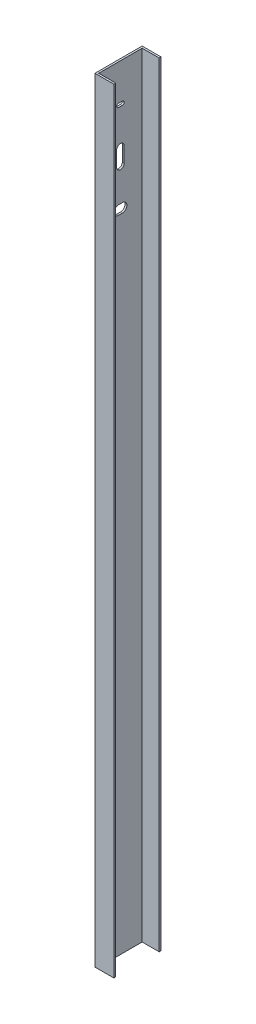
ISO-10303-21;
HEADER;
FILE_DESCRIPTION(('STEP AP214'),'2;1');
FILE_NAME('part.step','',(''),(''),'','','');
FILE_SCHEMA(('AUTOMOTIVE_DESIGN { 1 0 10303 214 1 1 1 1 }'));
ENDSEC;
DATA;
#1=APPLICATION_CONTEXT('core data for automotive mechanical design processes');
#2=APPLICATION_PROTOCOL_DEFINITION('international standard','automotive_design',2000,#1);
#3=PRODUCT_CONTEXT('',#1,'mechanical');
#4=PRODUCT('Part','Part','',(#3));
#5=PRODUCT_RELATED_PRODUCT_CATEGORY('part','',(#4));
#6=PRODUCT_DEFINITION_FORMATION('','',#4);
#7=PRODUCT_DEFINITION_CONTEXT('part definition',#1,'design');
#8=PRODUCT_DEFINITION('design','',#6,#7);
#9=PRODUCT_DEFINITION_SHAPE('','',#8);
#10=(LENGTH_UNIT() NAMED_UNIT(*) SI_UNIT(.MILLI.,.METRE.));
#11=(NAMED_UNIT(*) PLANE_ANGLE_UNIT() SI_UNIT($,.RADIAN.));
#12=(NAMED_UNIT(*) SI_UNIT($,.STERADIAN.) SOLID_ANGLE_UNIT());
#13=UNCERTAINTY_MEASURE_WITH_UNIT(LENGTH_MEASURE(1.E-05),#10,'distance_accuracy_value','');
#14=(GEOMETRIC_REPRESENTATION_CONTEXT(3) GLOBAL_UNCERTAINTY_ASSIGNED_CONTEXT((#13)) GLOBAL_UNIT_ASSIGNED_CONTEXT((#10,
#11,#12)) REPRESENTATION_CONTEXT('',''));
#15=CARTESIAN_POINT('',(0.,0.,0.));
#16=DIRECTION('',(0.,0.,1.));
#17=DIRECTION('',(1.,0.,0.));
#18=AXIS2_PLACEMENT_3D('',#15,#16,#17);
#19=CARTESIAN_POINT('',(0.,410.,0.));
#20=DIRECTION('',(1.,0.,0.));
#21=DIRECTION('',(0.,0.,-1.));
#22=AXIS2_PLACEMENT_3D('',#19,#20,#21);
#23=PLANE('',#22);
#24=DIRECTION('',(0.,0.,1.));
#25=VECTOR('',#24,1.);
#26=CARTESIAN_POINT('',(0.,339.6,11.5));
#27=LINE('',#26,#25);
#28=CARTESIAN_POINT('',(0.,339.6,11.5));
#29=VERTEX_POINT('',#28);
#30=CARTESIAN_POINT('',(0.,339.6,13.5));
#31=VERTEX_POINT('',#30);
#32=EDGE_CURVE('E183',#29,#31,#27,.T.);
#33=ORIENTED_EDGE('',*,*,#32,.F.);
#34=CARTESIAN_POINT('',(0.,342.,11.5));
#35=DIRECTION('',(-1.,0.,0.));
#36=DIRECTION('',(0.,0.,1.));
#37=AXIS2_PLACEMENT_3D('',#34,#35,#36);
#38=CIRCLE('',#37,2.40000000000001);
#39=CARTESIAN_POINT('',(0.,344.4,11.5));
#40=VERTEX_POINT('',#39);
#41=EDGE_CURVE('E49',#40,#29,#38,.T.);
#42=ORIENTED_EDGE('',*,*,#41,.F.);
#43=DIRECTION('',(0.,0.,1.));
#44=VECTOR('',#43,1.);
#45=CARTESIAN_POINT('',(0.,344.4,11.5));
#46=LINE('',#45,#44);
#47=CARTESIAN_POINT('',(0.,344.4,13.5));
#48=VERTEX_POINT('',#47);
#49=EDGE_CURVE('E189',#40,#48,#46,.T.);
#50=ORIENTED_EDGE('',*,*,#49,.T.);
#51=CARTESIAN_POINT('',(0.,342.,13.5));
#52=DIRECTION('',(-1.,0.,0.));
#53=DIRECTION('',(0.,0.,1.));
#54=AXIS2_PLACEMENT_3D('',#51,#52,#53);
#55=CIRCLE('',#54,2.40000000000001);
#56=EDGE_CURVE('E174',#31,#48,#55,.T.);
#57=ORIENTED_EDGE('',*,*,#56,.F.);
#58=EDGE_LOOP('',(#33,#42,#50,#57));
#59=FACE_BOUND('',#58,.T.);
#60=DIRECTION('',(0.,0.,1.));
#61=VECTOR('',#60,1.);
#62=CARTESIAN_POINT('',(0.,0.,0.));
#63=LINE('',#62,#61);
#64=CARTESIAN_POINT('',(0.,0.,0.));
#65=VERTEX_POINT('',#64);
#66=CARTESIAN_POINT('',(0.,0.,25.));
#67=VERTEX_POINT('',#66);
#68=EDGE_CURVE('E265',#65,#67,#63,.T.);
#69=ORIENTED_EDGE('',*,*,#68,.T.);
#70=DIRECTION('',(0.,-1.,0.));
#71=VECTOR('',#70,1.);
#72=CARTESIAN_POINT('',(0.,410.,25.));
#73=LINE('',#72,#71);
#74=CARTESIAN_POINT('',(0.,410.,25.));
#75=VERTEX_POINT('',#74);
#76=EDGE_CURVE('E296',#75,#67,#73,.T.);
#77=ORIENTED_EDGE('',*,*,#76,.F.);
#78=DIRECTION('',(0.,0.,1.));
#79=VECTOR('',#78,1.);
#80=CARTESIAN_POINT('',(0.,410.,0.));
#81=LINE('',#80,#79);
#82=CARTESIAN_POINT('',(0.,410.,0.));
#83=VERTEX_POINT('',#82);
#84=EDGE_CURVE('E266',#83,#75,#81,.T.);
#85=ORIENTED_EDGE('',*,*,#84,.F.);
#86=DIRECTION('',(0.,-1.,0.));
#87=VECTOR('',#86,1.);
#88=CARTESIAN_POINT('',(0.,410.,0.));
#89=LINE('',#88,#87);
#90=EDGE_CURVE('E278',#83,#65,#89,.T.);
#91=ORIENTED_EDGE('',*,*,#90,.T.);
#92=EDGE_LOOP('',(#69,#77,#85,#91));
#93=FACE_BOUND('',#92,.T.);
#94=DIRECTION('',(0.,0.,1.));
#95=VECTOR('',#94,1.);
#96=CARTESIAN_POINT('',(0.,389.,11.5));
#97=LINE('',#96,#95);
#98=CARTESIAN_POINT('',(0.,389.,11.5));
#99=VERTEX_POINT('',#98);
#100=CARTESIAN_POINT('',(0.,389.,13.5));
#101=VERTEX_POINT('',#100);
#102=EDGE_CURVE('E221',#99,#101,#97,.T.);
#103=ORIENTED_EDGE('',*,*,#102,.F.);
#104=CARTESIAN_POINT('',(0.,390.,11.5));
#105=DIRECTION('',(-1.,0.,0.));
#106=DIRECTION('',(0.,0.,1.));
#107=AXIS2_PLACEMENT_3D('',#104,#105,#106);
#108=CIRCLE('',#107,1.);
#109=CARTESIAN_POINT('',(0.,391.,11.5));
#110=VERTEX_POINT('',#109);
#111=EDGE_CURVE('E219',#110,#99,#108,.T.);
#112=ORIENTED_EDGE('',*,*,#111,.F.);
#113=DIRECTION('',(0.,0.,1.));
#114=VECTOR('',#113,1.);
#115=CARTESIAN_POINT('',(0.,391.,11.5));
#116=LINE('',#115,#114);
#117=CARTESIAN_POINT('',(0.,391.,13.5));
#118=VERTEX_POINT('',#117);
#119=EDGE_CURVE('E227',#110,#118,#116,.T.);
#120=ORIENTED_EDGE('',*,*,#119,.T.);
#121=CARTESIAN_POINT('',(0.,390.,13.5));
#122=DIRECTION('',(-1.,0.,0.));
#123=DIRECTION('',(0.,0.,1.));
#124=AXIS2_PLACEMENT_3D('',#121,#122,#123);
#125=CIRCLE('',#124,1.);
#126=EDGE_CURVE('E224',#101,#118,#125,.T.);
#127=ORIENTED_EDGE('',*,*,#126,.F.);
#128=EDGE_LOOP('',(#103,#112,#120,#127));
#129=FACE_BOUND('',#128,.T.);
#130=DIRECTION('',(0.,-1.,0.));
#131=VECTOR('',#130,1.);
#132=CARTESIAN_POINT('',(0.,370.,14.5));
#133=LINE('',#132,#131);
#134=CARTESIAN_POINT('',(0.,370.,14.5));
#135=VERTEX_POINT('',#134);
#136=CARTESIAN_POINT('',(0.,362.,14.5));
#137=VERTEX_POINT('',#136);
#138=EDGE_CURVE('E196',#135,#137,#133,.T.);
#139=ORIENTED_EDGE('',*,*,#138,.T.);
#140=CARTESIAN_POINT('',(0.,362.,12.5));
#141=DIRECTION('',(-1.,0.,0.));
#142=DIRECTION('',(0.,0.,1.));
#143=AXIS2_PLACEMENT_3D('',#140,#141,#142);
#144=CIRCLE('',#143,2.);
#145=CARTESIAN_POINT('',(0.,362.,10.5));
#146=VERTEX_POINT('',#145);
#147=EDGE_CURVE('E201',#146,#137,#144,.T.);
#148=ORIENTED_EDGE('',*,*,#147,.F.);
#149=DIRECTION('',(0.,-1.,0.));
#150=VECTOR('',#149,1.);
#151=CARTESIAN_POINT('',(0.,370.,10.5));
#152=LINE('',#151,#150);
#153=CARTESIAN_POINT('',(0.,370.,10.5));
#154=VERTEX_POINT('',#153);
#155=EDGE_CURVE('E204',#154,#146,#152,.T.);
#156=ORIENTED_EDGE('',*,*,#155,.F.);
#157=CARTESIAN_POINT('',(0.,370.,12.5));
#158=DIRECTION('',(-1.,0.,0.));
#159=DIRECTION('',(0.,0.,1.));
#160=AXIS2_PLACEMENT_3D('',#157,#158,#159);
#161=CIRCLE('',#160,2.);
#162=EDGE_CURVE('E207',#135,#154,#161,.T.);
#163=ORIENTED_EDGE('',*,*,#162,.F.);
#164=EDGE_LOOP('',(#139,#148,#156,#163));
#165=FACE_BOUND('',#164,.T.);
#166=ADVANCED_FACE('F35',(#59,#93,#129,#165),#23,.F.);
#167=CARTESIAN_POINT('',(1.,0.,1.));
#168=DIRECTION('',(-1.,0.,0.));
#169=DIRECTION('',(0.,0.,1.));
#170=AXIS2_PLACEMENT_3D('',#167,#168,#169);
#171=PLANE('',#170);
#172=DIRECTION('',(0.,0.,1.));
#173=VECTOR('',#172,1.);
#174=CARTESIAN_POINT('',(1.,344.4,1.));
#175=LINE('',#174,#173);
#176=CARTESIAN_POINT('',(1.00000000000011,344.4,11.5));
#177=VERTEX_POINT('',#176);
#178=CARTESIAN_POINT('',(1.00000000000011,344.4,13.5));
#179=VERTEX_POINT('',#178);
#180=EDGE_CURVE('E42',#177,#179,#175,.T.);
#181=ORIENTED_EDGE('',*,*,#180,.F.);
#182=CARTESIAN_POINT('',(1.,342.,11.5));
#183=DIRECTION('',(-1.,0.,0.));
#184=DIRECTION('',(0.,0.,1.));
#185=AXIS2_PLACEMENT_3D('',#182,#183,#184);
#186=CIRCLE('',#185,2.40000000000001);
#187=CARTESIAN_POINT('',(1.00000000000011,339.6,11.5));
#188=VERTEX_POINT('',#187);
#189=EDGE_CURVE('E11',#177,#188,#186,.T.);
#190=ORIENTED_EDGE('',*,*,#189,.T.);
#191=DIRECTION('',(0.,0.,1.));
#192=VECTOR('',#191,1.);
#193=CARTESIAN_POINT('',(1.,339.6,1.));
#194=LINE('',#193,#192);
#195=CARTESIAN_POINT('',(1.,339.6,13.5));
#196=VERTEX_POINT('',#195);
#197=EDGE_CURVE('E321',#188,#196,#194,.T.);
#198=ORIENTED_EDGE('',*,*,#197,.T.);
#199=CARTESIAN_POINT('',(1.,342.,13.5));
#200=DIRECTION('',(-1.,0.,0.));
#201=DIRECTION('',(0.,0.,1.));
#202=AXIS2_PLACEMENT_3D('',#199,#200,#201);
#203=CIRCLE('',#202,2.40000000000001);
#204=EDGE_CURVE('E177',#196,#179,#203,.T.);
#205=ORIENTED_EDGE('',*,*,#204,.T.);
#206=EDGE_LOOP('',(#181,#190,#198,#205));
#207=FACE_BOUND('',#206,.T.);
#208=DIRECTION('',(0.,0.,1.));
#209=VECTOR('',#208,1.);
#210=CARTESIAN_POINT('',(1.,410.,1.));
#211=LINE('',#210,#209);
#212=CARTESIAN_POINT('',(1.,410.,1.));
#213=VERTEX_POINT('',#212);
#214=CARTESIAN_POINT('',(1.,410.,24.));
#215=VERTEX_POINT('',#214);
#216=EDGE_CURVE('E252',#213,#215,#211,.T.);
#217=ORIENTED_EDGE('',*,*,#216,.T.);
#218=DIRECTION('',(0.,1.,0.));
#219=VECTOR('',#218,1.);
#220=CARTESIAN_POINT('',(1.,0.,24.));
#221=LINE('',#220,#219);
#222=CARTESIAN_POINT('',(1.,0.,24.));
#223=VERTEX_POINT('',#222);
#224=EDGE_CURVE('E260',#223,#215,#221,.T.);
#225=ORIENTED_EDGE('',*,*,#224,.F.);
#226=DIRECTION('',(0.,0.,1.));
#227=VECTOR('',#226,1.);
#228=CARTESIAN_POINT('',(1.,0.,1.));
#229=LINE('',#228,#227);
#230=CARTESIAN_POINT('',(1.,0.,1.));
#231=VERTEX_POINT('',#230);
#232=EDGE_CURVE('E242',#231,#223,#229,.T.);
#233=ORIENTED_EDGE('',*,*,#232,.F.);
#234=DIRECTION('',(0.,1.,0.));
#235=VECTOR('',#234,1.);
#236=CARTESIAN_POINT('',(1.,0.,1.));
#237=LINE('',#236,#235);
#238=EDGE_CURVE('E258',#231,#213,#237,.T.);
#239=ORIENTED_EDGE('',*,*,#238,.T.);
#240=EDGE_LOOP('',(#217,#225,#233,#239));
#241=FACE_BOUND('',#240,.T.);
#242=DIRECTION('',(0.,0.,1.));
#243=VECTOR('',#242,1.);
#244=CARTESIAN_POINT('',(1.,391.,1.));
#245=LINE('',#244,#243);
#246=CARTESIAN_POINT('',(1.00000000000011,391.,11.5));
#247=VERTEX_POINT('',#246);
#248=CARTESIAN_POINT('',(1.00000000000011,391.,13.5));
#249=VERTEX_POINT('',#248);
#250=EDGE_CURVE('E305',#247,#249,#245,.T.);
#251=ORIENTED_EDGE('',*,*,#250,.F.);
#252=CARTESIAN_POINT('',(1.,390.,11.5));
#253=DIRECTION('',(-1.,0.,0.));
#254=DIRECTION('',(0.,0.,1.));
#255=AXIS2_PLACEMENT_3D('',#252,#253,#254);
#256=CIRCLE('',#255,1.);
#257=CARTESIAN_POINT('',(1.00000000000011,389.,11.5));
#258=VERTEX_POINT('',#257);
#259=EDGE_CURVE('E307',#247,#258,#256,.T.);
#260=ORIENTED_EDGE('',*,*,#259,.T.);
#261=DIRECTION('',(0.,0.,1.));
#262=VECTOR('',#261,1.);
#263=CARTESIAN_POINT('',(1.,389.,1.));
#264=LINE('',#263,#262);
#265=CARTESIAN_POINT('',(1.,389.,13.5));
#266=VERTEX_POINT('',#265);
#267=EDGE_CURVE('E299',#258,#266,#264,.T.);
#268=ORIENTED_EDGE('',*,*,#267,.T.);
#269=CARTESIAN_POINT('',(1.,390.,13.5));
#270=DIRECTION('',(-1.,0.,0.));
#271=DIRECTION('',(0.,0.,1.));
#272=AXIS2_PLACEMENT_3D('',#269,#270,#271);
#273=CIRCLE('',#272,1.);
#274=EDGE_CURVE('E302',#266,#249,#273,.T.);
#275=ORIENTED_EDGE('',*,*,#274,.T.);
#276=EDGE_LOOP('',(#251,#260,#268,#275));
#277=FACE_BOUND('',#276,.T.);
#278=DIRECTION('',(0.,-1.,0.));
#279=VECTOR('',#278,1.);
#280=CARTESIAN_POINT('',(1.,0.,14.5000000000001));
#281=LINE('',#280,#279);
#282=CARTESIAN_POINT('',(1.00000000000011,370.,14.5));
#283=VERTEX_POINT('',#282);
#284=CARTESIAN_POINT('',(1.00000000000011,362.,14.5));
#285=VERTEX_POINT('',#284);
#286=EDGE_CURVE('E319',#283,#285,#281,.T.);
#287=ORIENTED_EDGE('',*,*,#286,.F.);
#288=CARTESIAN_POINT('',(1.,370.,12.5));
#289=DIRECTION('',(-1.,0.,0.));
#290=DIRECTION('',(0.,0.,1.));
#291=AXIS2_PLACEMENT_3D('',#288,#289,#290);
#292=CIRCLE('',#291,2.);
#293=CARTESIAN_POINT('',(1.,370.,10.5));
#294=VERTEX_POINT('',#293);
#295=EDGE_CURVE('E310',#283,#294,#292,.T.);
#296=ORIENTED_EDGE('',*,*,#295,.T.);
#297=DIRECTION('',(0.,-1.,0.));
#298=VECTOR('',#297,1.);
#299=CARTESIAN_POINT('',(1.,0.,10.5));
#300=LINE('',#299,#298);
#301=CARTESIAN_POINT('',(1.00000000000011,362.,10.5));
#302=VERTEX_POINT('',#301);
#303=EDGE_CURVE('E313',#294,#302,#300,.T.);
#304=ORIENTED_EDGE('',*,*,#303,.T.);
#305=CARTESIAN_POINT('',(1.,362.,12.5));
#306=DIRECTION('',(-1.,0.,0.));
#307=DIRECTION('',(0.,0.,1.));
#308=AXIS2_PLACEMENT_3D('',#305,#306,#307);
#309=CIRCLE('',#308,2.);
#310=EDGE_CURVE('E316',#302,#285,#309,.T.);
#311=ORIENTED_EDGE('',*,*,#310,.T.);
#312=EDGE_LOOP('',(#287,#296,#304,#311));
#313=FACE_BOUND('',#312,.T.);
#314=ADVANCED_FACE('F328',(#207,#241,#277,#313),#171,.F.);
#315=CARTESIAN_POINT('',(10.,410.,0.));
#316=DIRECTION('',(-1.,0.,0.));
#317=DIRECTION('',(0.,0.,1.));
#318=AXIS2_PLACEMENT_3D('',#315,#316,#317);
#319=PLANE('',#318);
#320=DIRECTION('',(0.,1.,0.));
#321=VECTOR('',#320,1.);
#322=CARTESIAN_POINT('',(10.,0.,24.));
#323=LINE('',#322,#321);
#324=CARTESIAN_POINT('',(10.,0.,24.));
#325=VERTEX_POINT('',#324);
#326=CARTESIAN_POINT('',(10.,410.,24.));
#327=VERTEX_POINT('',#326);
#328=EDGE_CURVE('E262',#325,#327,#323,.T.);
#329=ORIENTED_EDGE('',*,*,#328,.T.);
#330=DIRECTION('',(0.,0.,-1.));
#331=VECTOR('',#330,1.);
#332=CARTESIAN_POINT('',(10.,410.,0.));
#333=LINE('',#332,#331);
#334=CARTESIAN_POINT('',(10.,410.,25.));
#335=VERTEX_POINT('',#334);
#336=EDGE_CURVE('E273',#335,#327,#333,.T.);
#337=ORIENTED_EDGE('',*,*,#336,.F.);
#338=DIRECTION('',(0.,-1.,0.));
#339=VECTOR('',#338,1.);
#340=CARTESIAN_POINT('',(10.,410.,25.));
#341=LINE('',#340,#339);
#342=CARTESIAN_POINT('',(10.,0.,25.));
#343=VERTEX_POINT('',#342);
#344=EDGE_CURVE('E293',#335,#343,#341,.T.);
#345=ORIENTED_EDGE('',*,*,#344,.T.);
#346=DIRECTION('',(0.,0.,-1.));
#347=VECTOR('',#346,1.);
#348=CARTESIAN_POINT('',(10.,0.,0.));
#349=LINE('',#348,#347);
#350=EDGE_CURVE('E284',#343,#325,#349,.T.);
#351=ORIENTED_EDGE('',*,*,#350,.T.);
#352=EDGE_LOOP('',(#329,#337,#345,#351));
#353=FACE_BOUND('',#352,.T.);
#354=ADVANCED_FACE('F347',(#353),#319,.F.);
#355=CARTESIAN_POINT('',(0.,410.,0.));
#356=DIRECTION('',(0.,1.,0.));
#357=DIRECTION('',(0.,0.,1.));
#358=AXIS2_PLACEMENT_3D('',#355,#356,#357);
#359=PLANE('',#358);
#360=ORIENTED_EDGE('',*,*,#336,.T.);
#361=DIRECTION('',(-1.,0.,0.));
#362=VECTOR('',#361,1.);
#363=CARTESIAN_POINT('',(10.,410.,24.));
#364=LINE('',#363,#362);
#365=EDGE_CURVE('E233',#327,#215,#364,.T.);
#366=ORIENTED_EDGE('',*,*,#365,.T.);
#367=ORIENTED_EDGE('',*,*,#216,.F.);
#368=DIRECTION('',(-1.,0.,0.));
#369=VECTOR('',#368,1.);
#370=CARTESIAN_POINT('',(10.,410.,1.));
#371=LINE('',#370,#369);
#372=CARTESIAN_POINT('',(10.,410.,1.));
#373=VERTEX_POINT('',#372);
#374=EDGE_CURVE('E243',#373,#213,#371,.T.);
#375=ORIENTED_EDGE('',*,*,#374,.F.);
#376=CARTESIAN_POINT('',(10.,410.,0.));
#377=VERTEX_POINT('',#376);
#378=EDGE_CURVE('E272',#373,#377,#333,.T.);
#379=ORIENTED_EDGE('',*,*,#378,.T.);
#380=DIRECTION('',(-1.,0.,0.));
#381=VECTOR('',#380,1.);
#382=CARTESIAN_POINT('',(0.,410.,0.));
#383=LINE('',#382,#381);
#384=EDGE_CURVE('E276',#377,#83,#383,.T.);
#385=ORIENTED_EDGE('',*,*,#384,.T.);
#386=ORIENTED_EDGE('',*,*,#84,.T.);
#387=DIRECTION('',(1.,0.,0.));
#388=VECTOR('',#387,1.);
#389=CARTESIAN_POINT('',(0.,410.,25.));
#390=LINE('',#389,#388);
#391=EDGE_CURVE('E269',#75,#335,#390,.T.);
#392=ORIENTED_EDGE('',*,*,#391,.T.);
#393=EDGE_LOOP('',(#360,#366,#367,#375,#379,#385,#386,#392));
#394=FACE_BOUND('',#393,.T.);
#395=ADVANCED_FACE('F352',(#394),#359,.T.);
#396=CARTESIAN_POINT('',(0.,0.,0.));
#397=DIRECTION('',(0.,1.,0.));
#398=DIRECTION('',(0.,0.,1.));
#399=AXIS2_PLACEMENT_3D('',#396,#397,#398);
#400=PLANE('',#399);
#401=DIRECTION('',(-1.,0.,0.));
#402=VECTOR('',#401,1.);
#403=CARTESIAN_POINT('',(10.,0.,24.));
#404=LINE('',#403,#402);
#405=EDGE_CURVE('E240',#325,#223,#404,.T.);
#406=ORIENTED_EDGE('',*,*,#405,.F.);
#407=ORIENTED_EDGE('',*,*,#350,.F.);
#408=DIRECTION('',(1.,0.,0.));
#409=VECTOR('',#408,1.);
#410=CARTESIAN_POINT('',(0.,0.,25.));
#411=LINE('',#410,#409);
#412=EDGE_CURVE('E281',#67,#343,#411,.T.);
#413=ORIENTED_EDGE('',*,*,#412,.F.);
#414=ORIENTED_EDGE('',*,*,#68,.F.);
#415=DIRECTION('',(-1.,0.,0.));
#416=VECTOR('',#415,1.);
#417=CARTESIAN_POINT('',(0.,0.,0.));
#418=LINE('',#417,#416);
#419=CARTESIAN_POINT('',(10.,0.,0.));
#420=VERTEX_POINT('',#419);
#421=EDGE_CURVE('E270',#420,#65,#418,.T.);
#422=ORIENTED_EDGE('',*,*,#421,.F.);
#423=CARTESIAN_POINT('',(10.,0.,1.));
#424=VERTEX_POINT('',#423);
#425=EDGE_CURVE('E283',#424,#420,#349,.T.);
#426=ORIENTED_EDGE('',*,*,#425,.F.);
#427=DIRECTION('',(-1.,0.,0.));
#428=VECTOR('',#427,1.);
#429=CARTESIAN_POINT('',(10.,0.,1.));
#430=LINE('',#429,#428);
#431=EDGE_CURVE('E246',#424,#231,#430,.T.);
#432=ORIENTED_EDGE('',*,*,#431,.T.);
#433=ORIENTED_EDGE('',*,*,#232,.T.);
#434=EDGE_LOOP('',(#406,#407,#413,#414,#422,#426,#432,#433));
#435=FACE_BOUND('',#434,.T.);
#436=ADVANCED_FACE('F367',(#435),#400,.F.);
#437=CARTESIAN_POINT('',(0.,410.,25.));
#438=DIRECTION('',(0.,0.,-1.));
#439=DIRECTION('',(-1.,0.,0.));
#440=AXIS2_PLACEMENT_3D('',#437,#438,#439);
#441=PLANE('',#440);
#442=ORIENTED_EDGE('',*,*,#412,.T.);
#443=ORIENTED_EDGE('',*,*,#344,.F.);
#444=ORIENTED_EDGE('',*,*,#391,.F.);
#445=ORIENTED_EDGE('',*,*,#76,.T.);
#446=EDGE_LOOP('',(#442,#443,#444,#445));
#447=FACE_BOUND('',#446,.T.);
#448=ADVANCED_FACE('F371',(#447),#441,.F.);
#449=ORIENTED_EDGE('',*,*,#378,.F.);
#450=DIRECTION('',(0.,1.,0.));
#451=VECTOR('',#450,1.);
#452=CARTESIAN_POINT('',(10.,0.,1.));
#453=LINE('',#452,#451);
#454=EDGE_CURVE('E249',#424,#373,#453,.T.);
#455=ORIENTED_EDGE('',*,*,#454,.F.);
#456=ORIENTED_EDGE('',*,*,#425,.T.);
#457=DIRECTION('',(0.,-1.,0.));
#458=VECTOR('',#457,1.);
#459=CARTESIAN_POINT('',(10.,410.,0.));
#460=LINE('',#459,#458);
#461=EDGE_CURVE('E290',#377,#420,#460,.T.);
#462=ORIENTED_EDGE('',*,*,#461,.F.);
#463=EDGE_LOOP('',(#449,#455,#456,#462));
#464=FACE_BOUND('',#463,.T.);
#465=ADVANCED_FACE('F355',(#464),#319,.F.);
#466=CARTESIAN_POINT('',(0.,410.,0.));
#467=DIRECTION('',(0.,0.,1.));
#468=DIRECTION('',(1.,0.,0.));
#469=AXIS2_PLACEMENT_3D('',#466,#467,#468);
#470=PLANE('',#469);
#471=ORIENTED_EDGE('',*,*,#421,.T.);
#472=ORIENTED_EDGE('',*,*,#90,.F.);
#473=ORIENTED_EDGE('',*,*,#384,.F.);
#474=ORIENTED_EDGE('',*,*,#461,.T.);
#475=EDGE_LOOP('',(#471,#472,#473,#474));
#476=FACE_BOUND('',#475,.T.);
#477=ADVANCED_FACE('F363',(#476),#470,.F.);
#478=CARTESIAN_POINT('',(10.,0.,24.));
#479=DIRECTION('',(0.,0.,-1.));
#480=DIRECTION('',(-1.,0.,0.));
#481=AXIS2_PLACEMENT_3D('',#478,#479,#480);
#482=PLANE('',#481);
#483=ORIENTED_EDGE('',*,*,#365,.F.);
#484=ORIENTED_EDGE('',*,*,#328,.F.);
#485=ORIENTED_EDGE('',*,*,#405,.T.);
#486=ORIENTED_EDGE('',*,*,#224,.T.);
#487=EDGE_LOOP('',(#483,#484,#485,#486));
#488=FACE_BOUND('',#487,.T.);
#489=ADVANCED_FACE('F360',(#488),#482,.T.);
#490=CARTESIAN_POINT('',(10.,0.,1.));
#491=DIRECTION('',(0.,0.,-1.));
#492=DIRECTION('',(-1.,0.,0.));
#493=AXIS2_PLACEMENT_3D('',#490,#491,#492);
#494=PLANE('',#493);
#495=ORIENTED_EDGE('',*,*,#374,.T.);
#496=ORIENTED_EDGE('',*,*,#238,.F.);
#497=ORIENTED_EDGE('',*,*,#431,.F.);
#498=ORIENTED_EDGE('',*,*,#454,.T.);
#499=EDGE_LOOP('',(#495,#496,#497,#498));
#500=FACE_BOUND('',#499,.T.);
#501=ADVANCED_FACE('F358',(#500),#494,.F.);
#502=CARTESIAN_POINT('',(410.,390.,11.5));
#503=DIRECTION('',(-1.,0.,0.));
#504=DIRECTION('',(0.,0.,1.));
#505=AXIS2_PLACEMENT_3D('',#502,#503,#504);
#506=CYLINDRICAL_SURFACE('',#505,1.);
#507=DIRECTION('',(-1.,0.,0.));
#508=VECTOR('',#507,1.);
#509=CARTESIAN_POINT('',(410.,391.,11.5));
#510=LINE('',#509,#508);
#511=EDGE_CURVE('E231',#247,#110,#510,.T.);
#512=ORIENTED_EDGE('',*,*,#511,.T.);
#513=ORIENTED_EDGE('',*,*,#111,.T.);
#514=DIRECTION('',(-1.,0.,0.));
#515=VECTOR('',#514,1.);
#516=CARTESIAN_POINT('',(410.,389.,11.5));
#517=LINE('',#516,#515);
#518=EDGE_CURVE('E230',#258,#99,#517,.T.);
#519=ORIENTED_EDGE('',*,*,#518,.F.);
#520=ORIENTED_EDGE('',*,*,#259,.F.);
#521=EDGE_LOOP('',(#512,#513,#519,#520));
#522=FACE_BOUND('',#521,.T.);
#523=ADVANCED_FACE('F403',(#522),#506,.F.);
#524=CARTESIAN_POINT('',(410.,391.,11.5));
#525=DIRECTION('',(0.,-1.,0.));
#526=DIRECTION('',(0.,0.,-1.));
#527=AXIS2_PLACEMENT_3D('',#524,#525,#526);
#528=PLANE('',#527);
#529=ORIENTED_EDGE('',*,*,#250,.T.);
#530=DIRECTION('',(-1.,0.,0.));
#531=VECTOR('',#530,1.);
#532=CARTESIAN_POINT('',(410.,391.,13.5));
#533=LINE('',#532,#531);
#534=EDGE_CURVE('E234',#249,#118,#533,.T.);
#535=ORIENTED_EDGE('',*,*,#534,.T.);
#536=ORIENTED_EDGE('',*,*,#119,.F.);
#537=ORIENTED_EDGE('',*,*,#511,.F.);
#538=EDGE_LOOP('',(#529,#535,#536,#537));
#539=FACE_BOUND('',#538,.T.);
#540=ADVANCED_FACE('F407',(#539),#528,.T.);
#541=CARTESIAN_POINT('',(410.,390.,13.5));
#542=DIRECTION('',(-1.,0.,0.));
#543=DIRECTION('',(0.,0.,1.));
#544=AXIS2_PLACEMENT_3D('',#541,#542,#543);
#545=CYLINDRICAL_SURFACE('',#544,1.);
#546=DIRECTION('',(-1.,0.,0.));
#547=VECTOR('',#546,1.);
#548=CARTESIAN_POINT('',(410.,389.,13.5));
#549=LINE('',#548,#547);
#550=EDGE_CURVE('E236',#266,#101,#549,.T.);
#551=ORIENTED_EDGE('',*,*,#550,.T.);
#552=ORIENTED_EDGE('',*,*,#126,.T.);
#553=ORIENTED_EDGE('',*,*,#534,.F.);
#554=ORIENTED_EDGE('',*,*,#274,.F.);
#555=EDGE_LOOP('',(#551,#552,#553,#554));
#556=FACE_BOUND('',#555,.T.);
#557=ADVANCED_FACE('F412',(#556),#545,.F.);
#558=CARTESIAN_POINT('',(410.,389.,11.5));
#559=DIRECTION('',(0.,-1.,0.));
#560=DIRECTION('',(0.,0.,-1.));
#561=AXIS2_PLACEMENT_3D('',#558,#559,#560);
#562=PLANE('',#561);
#563=ORIENTED_EDGE('',*,*,#518,.T.);
#564=ORIENTED_EDGE('',*,*,#102,.T.);
#565=ORIENTED_EDGE('',*,*,#550,.F.);
#566=ORIENTED_EDGE('',*,*,#267,.F.);
#567=EDGE_LOOP('',(#563,#564,#565,#566));
#568=FACE_BOUND('',#567,.T.);
#569=ADVANCED_FACE('F416',(#568),#562,.F.);
#570=CARTESIAN_POINT('',(410.,370.,14.5));
#571=DIRECTION('',(0.,0.,-1.));
#572=DIRECTION('',(0.,1.,0.));
#573=AXIS2_PLACEMENT_3D('',#570,#571,#572);
#574=PLANE('',#573);
#575=ORIENTED_EDGE('',*,*,#286,.T.);
#576=DIRECTION('',(-1.,0.,0.));
#577=VECTOR('',#576,1.);
#578=CARTESIAN_POINT('',(410.,362.,14.5));
#579=LINE('',#578,#577);
#580=EDGE_CURVE('E217',#285,#137,#579,.T.);
#581=ORIENTED_EDGE('',*,*,#580,.T.);
#582=ORIENTED_EDGE('',*,*,#138,.F.);
#583=DIRECTION('',(-1.,0.,0.));
#584=VECTOR('',#583,1.);
#585=CARTESIAN_POINT('',(410.,370.,14.5));
#586=LINE('',#585,#584);
#587=EDGE_CURVE('E210',#283,#135,#586,.T.);
#588=ORIENTED_EDGE('',*,*,#587,.F.);
#589=EDGE_LOOP('',(#575,#581,#582,#588));
#590=FACE_BOUND('',#589,.T.);
#591=ADVANCED_FACE('F419',(#590),#574,.T.);
#592=CARTESIAN_POINT('',(410.,362.,12.5));
#593=DIRECTION('',(-1.,0.,0.));
#594=DIRECTION('',(0.,0.,1.));
#595=AXIS2_PLACEMENT_3D('',#592,#593,#594);
#596=CYLINDRICAL_SURFACE('',#595,2.);
#597=DIRECTION('',(-1.,0.,0.));
#598=VECTOR('',#597,1.);
#599=CARTESIAN_POINT('',(410.,362.,10.5));
#600=LINE('',#599,#598);
#601=EDGE_CURVE('E215',#302,#146,#600,.T.);
#602=ORIENTED_EDGE('',*,*,#601,.T.);
#603=ORIENTED_EDGE('',*,*,#147,.T.);
#604=ORIENTED_EDGE('',*,*,#580,.F.);
#605=ORIENTED_EDGE('',*,*,#310,.F.);
#606=EDGE_LOOP('',(#602,#603,#604,#605));
#607=FACE_BOUND('',#606,.T.);
#608=ADVANCED_FACE('F426',(#607),#596,.F.);
#609=CARTESIAN_POINT('',(410.,370.,10.5));
#610=DIRECTION('',(0.,0.,-1.));
#611=DIRECTION('',(-1.,0.,0.));
#612=AXIS2_PLACEMENT_3D('',#609,#610,#611);
#613=PLANE('',#612);
#614=DIRECTION('',(-1.,0.,0.));
#615=VECTOR('',#614,1.);
#616=CARTESIAN_POINT('',(410.,370.,10.5));
#617=LINE('',#616,#615);
#618=EDGE_CURVE('E213',#294,#154,#617,.T.);
#619=ORIENTED_EDGE('',*,*,#618,.T.);
#620=ORIENTED_EDGE('',*,*,#155,.T.);
#621=ORIENTED_EDGE('',*,*,#601,.F.);
#622=ORIENTED_EDGE('',*,*,#303,.F.);
#623=EDGE_LOOP('',(#619,#620,#621,#622));
#624=FACE_BOUND('',#623,.T.);
#625=ADVANCED_FACE('F339',(#624),#613,.F.);
#626=CARTESIAN_POINT('',(410.,370.,12.5));
#627=DIRECTION('',(-1.,0.,0.));
#628=DIRECTION('',(0.,0.,1.));
#629=AXIS2_PLACEMENT_3D('',#626,#627,#628);
#630=CYLINDRICAL_SURFACE('',#629,2.);
#631=ORIENTED_EDGE('',*,*,#587,.T.);
#632=ORIENTED_EDGE('',*,*,#162,.T.);
#633=ORIENTED_EDGE('',*,*,#618,.F.);
#634=ORIENTED_EDGE('',*,*,#295,.F.);
#635=EDGE_LOOP('',(#631,#632,#633,#634));
#636=FACE_BOUND('',#635,.T.);
#637=ADVANCED_FACE('F332',(#636),#630,.F.);
#638=CARTESIAN_POINT('',(410.,342.,11.5));
#639=DIRECTION('',(-1.,0.,0.));
#640=DIRECTION('',(0.,0.,1.));
#641=AXIS2_PLACEMENT_3D('',#638,#639,#640);
#642=CYLINDRICAL_SURFACE('',#641,2.40000000000001);
#643=DIRECTION('',(-1.,0.,0.));
#644=VECTOR('',#643,1.);
#645=CARTESIAN_POINT('',(410.,344.4,11.5));
#646=LINE('',#645,#644);
#647=EDGE_CURVE('E194',#177,#40,#646,.T.);
#648=ORIENTED_EDGE('',*,*,#647,.T.);
#649=ORIENTED_EDGE('',*,*,#41,.T.);
#650=DIRECTION('',(-1.,0.,0.));
#651=VECTOR('',#650,1.);
#652=CARTESIAN_POINT('',(410.,339.6,11.5));
#653=LINE('',#652,#651);
#654=EDGE_CURVE('E180',#188,#29,#653,.T.);
#655=ORIENTED_EDGE('',*,*,#654,.F.);
#656=ORIENTED_EDGE('',*,*,#189,.F.);
#657=EDGE_LOOP('',(#648,#649,#655,#656));
#658=FACE_BOUND('',#657,.T.);
#659=ADVANCED_FACE('F330',(#658),#642,.F.);
#660=CARTESIAN_POINT('',(410.,344.4,11.5));
#661=DIRECTION('',(0.,-1.,0.));
#662=DIRECTION('',(0.,0.,-1.));
#663=AXIS2_PLACEMENT_3D('',#660,#661,#662);
#664=PLANE('',#663);
#665=ORIENTED_EDGE('',*,*,#180,.T.);
#666=DIRECTION('',(-1.,0.,0.));
#667=VECTOR('',#666,1.);
#668=CARTESIAN_POINT('',(410.,344.4,13.5));
#669=LINE('',#668,#667);
#670=EDGE_CURVE('E179',#179,#48,#669,.T.);
#671=ORIENTED_EDGE('',*,*,#670,.T.);
#672=ORIENTED_EDGE('',*,*,#49,.F.);
#673=ORIENTED_EDGE('',*,*,#647,.F.);
#674=EDGE_LOOP('',(#665,#671,#672,#673));
#675=FACE_BOUND('',#674,.T.);
#676=ADVANCED_FACE('F326',(#675),#664,.T.);
#677=CARTESIAN_POINT('',(410.,342.,13.5));
#678=DIRECTION('',(-1.,0.,0.));
#679=DIRECTION('',(0.,0.,1.));
#680=AXIS2_PLACEMENT_3D('',#677,#678,#679);
#681=CYLINDRICAL_SURFACE('',#680,2.40000000000001);
#682=DIRECTION('',(-1.,0.,0.));
#683=VECTOR('',#682,1.);
#684=CARTESIAN_POINT('',(410.,339.6,13.5));
#685=LINE('',#684,#683);
#686=EDGE_CURVE('E57',#196,#31,#685,.T.);
#687=ORIENTED_EDGE('',*,*,#686,.T.);
#688=ORIENTED_EDGE('',*,*,#56,.T.);
#689=ORIENTED_EDGE('',*,*,#670,.F.);
#690=ORIENTED_EDGE('',*,*,#204,.F.);
#691=EDGE_LOOP('',(#687,#688,#689,#690));
#692=FACE_BOUND('',#691,.T.);
#693=ADVANCED_FACE('F171',(#692),#681,.F.);
#694=CARTESIAN_POINT('',(410.,339.6,11.5));
#695=DIRECTION('',(0.,-1.,0.));
#696=DIRECTION('',(0.,0.,-1.));
#697=AXIS2_PLACEMENT_3D('',#694,#695,#696);
#698=PLANE('',#697);
#699=ORIENTED_EDGE('',*,*,#654,.T.);
#700=ORIENTED_EDGE('',*,*,#32,.T.);
#701=ORIENTED_EDGE('',*,*,#686,.F.);
#702=ORIENTED_EDGE('',*,*,#197,.F.);
#703=EDGE_LOOP('',(#699,#700,#701,#702));
#704=FACE_BOUND('',#703,.T.);
#705=ADVANCED_FACE('F184',(#704),#698,.F.);
#706=CLOSED_SHELL('',(#166,#314,#354,#395,#436,#448,#465,#477,#489,#501,#523,#540,#557,#569,
#591,#608,#625,#637,#659,#676,#693,#705));
#707=MANIFOLD_SOLID_BREP('B2',#706);
#708=ADVANCED_BREP_SHAPE_REPRESENTATION('',(#18,#707),#14);
#709=SHAPE_DEFINITION_REPRESENTATION(#9,#708);
ENDSEC;
END-ISO-10303-21;
